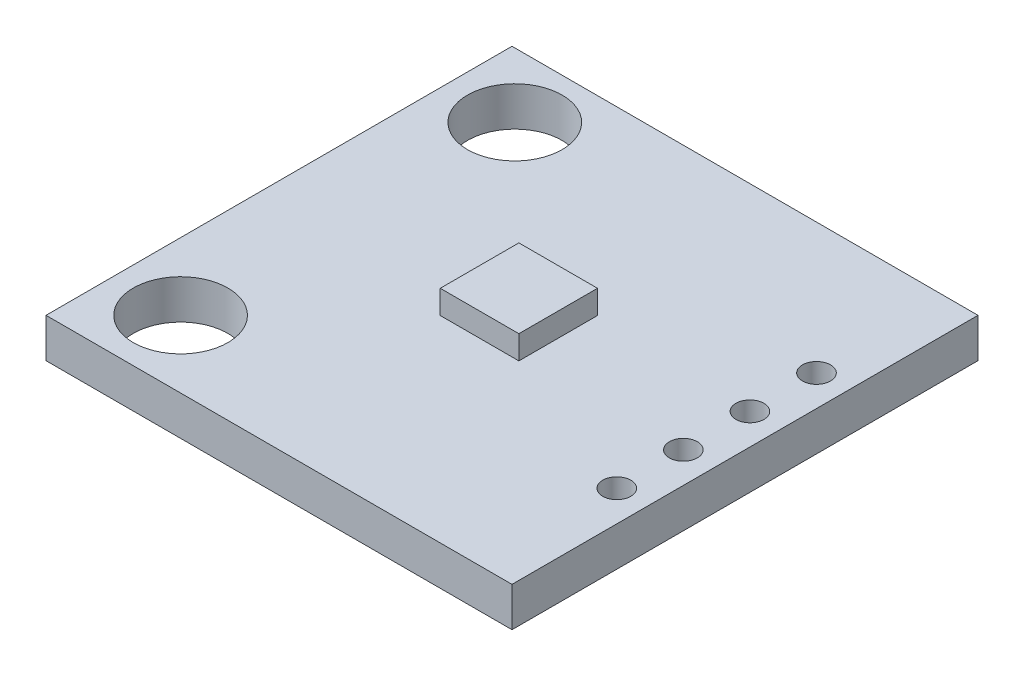
ISO-10303-21;
HEADER;
FILE_DESCRIPTION(('STEP AP214'),'2;1');
FILE_NAME('part.step','',(''),(''),'','','');
FILE_SCHEMA(('AUTOMOTIVE_DESIGN { 1 0 10303 214 1 1 1 1 }'));
ENDSEC;
DATA;
#1=APPLICATION_CONTEXT('core data for automotive mechanical design processes');
#2=APPLICATION_PROTOCOL_DEFINITION('international standard','automotive_design',2000,#1);
#3=PRODUCT_CONTEXT('',#1,'mechanical');
#4=PRODUCT('Part','Part','',(#3));
#5=PRODUCT_RELATED_PRODUCT_CATEGORY('part','',(#4));
#6=PRODUCT_DEFINITION_FORMATION('','',#4);
#7=PRODUCT_DEFINITION_CONTEXT('part definition',#1,'design');
#8=PRODUCT_DEFINITION('design','',#6,#7);
#9=PRODUCT_DEFINITION_SHAPE('','',#8);
#10=(LENGTH_UNIT() NAMED_UNIT(*) SI_UNIT(.MILLI.,.METRE.));
#11=(NAMED_UNIT(*) PLANE_ANGLE_UNIT() SI_UNIT($,.RADIAN.));
#12=(NAMED_UNIT(*) SI_UNIT($,.STERADIAN.) SOLID_ANGLE_UNIT());
#13=UNCERTAINTY_MEASURE_WITH_UNIT(LENGTH_MEASURE(1.E-05),#10,'distance_accuracy_value','');
#14=(GEOMETRIC_REPRESENTATION_CONTEXT(3) GLOBAL_UNCERTAINTY_ASSIGNED_CONTEXT((#13)) GLOBAL_UNIT_ASSIGNED_CONTEXT((#10,
#11,#12)) REPRESENTATION_CONTEXT('',''));
#15=CARTESIAN_POINT('',(0.,0.,0.));
#16=DIRECTION('',(0.,0.,1.));
#17=DIRECTION('',(1.,0.,0.));
#18=AXIS2_PLACEMENT_3D('',#15,#16,#17);
#19=CARTESIAN_POINT('',(0.,1.5,0.));
#20=DIRECTION('',(0.,1.,0.));
#21=DIRECTION('',(0.,0.,1.));
#22=AXIS2_PLACEMENT_3D('',#19,#20,#21);
#23=PLANE('',#22);
#24=DIRECTION('',(0.,0.,1.));
#25=VECTOR('',#24,1.);
#26=CARTESIAN_POINT('',(-29.829781644705,1.5,21.4809932118614));
#27=LINE('',#26,#25);
#28=CARTESIAN_POINT('',(-29.829781644705,1.5,21.4809932118614));
#29=VERTEX_POINT('',#28);
#30=CARTESIAN_POINT('',(-29.829781644705,1.5,39.2609932118614));
#31=VERTEX_POINT('',#30);
#32=EDGE_CURVE('E174',#29,#31,#27,.T.);
#33=ORIENTED_EDGE('',*,*,#32,.T.);
#34=DIRECTION('',(1.,0.,0.));
#35=VECTOR('',#34,1.);
#36=CARTESIAN_POINT('',(-29.829781644705,1.5,39.2609932118614));
#37=LINE('',#36,#35);
#38=CARTESIAN_POINT('',(-12.049781644705,1.5,39.2609932118614));
#39=VERTEX_POINT('',#38);
#40=EDGE_CURVE('E85',#31,#39,#37,.T.);
#41=ORIENTED_EDGE('',*,*,#40,.T.);
#42=DIRECTION('',(0.,0.,1.));
#43=VECTOR('',#42,1.);
#44=CARTESIAN_POINT('',(-12.049781644705,1.5,21.4809932118614));
#45=LINE('',#44,#43);
#46=CARTESIAN_POINT('',(-12.049781644705,1.5,21.4809932118614));
#47=VERTEX_POINT('',#46);
#48=EDGE_CURVE('E178',#47,#39,#45,.T.);
#49=ORIENTED_EDGE('',*,*,#48,.F.);
#50=DIRECTION('',(1.,0.,0.));
#51=VECTOR('',#50,1.);
#52=CARTESIAN_POINT('',(-29.829781644705,1.5,21.4809932118614));
#53=LINE('',#52,#51);
#54=EDGE_CURVE('E181',#29,#47,#53,.T.);
#55=ORIENTED_EDGE('',*,*,#54,.F.);
#56=EDGE_LOOP('',(#33,#41,#49,#55));
#57=FACE_BOUND('',#56,.T.);
#58=CARTESIAN_POINT('',(-27.2622861013751,1.5,23.9415089843509));
#59=DIRECTION('',(0.,1.,0.));
#60=DIRECTION('',(0.,0.,1.));
#61=AXIS2_PLACEMENT_3D('',#58,#59,#60);
#62=CIRCLE('',#61,1.80463173106967);
#63=CARTESIAN_POINT('',(-27.2622861013751,1.5,25.7461407154205));
#64=VERTEX_POINT('',#63);
#65=EDGE_CURVE('E167',#64,#64,#62,.T.);
#66=ORIENTED_EDGE('',*,*,#65,.F.);
#67=EDGE_LOOP('',(#66));
#68=FACE_BOUND('',#67,.T.);
#69=CARTESIAN_POINT('',(-27.2622861013751,1.5,36.6934976685315));
#70=DIRECTION('',(0.,1.,0.));
#71=DIRECTION('',(0.,0.,1.));
#72=AXIS2_PLACEMENT_3D('',#69,#70,#71);
#73=CIRCLE('',#72,1.80463173106967);
#74=CARTESIAN_POINT('',(-27.2622861013751,1.5,38.4981293996011));
#75=VERTEX_POINT('',#74);
#76=EDGE_CURVE('E161',#75,#75,#73,.T.);
#77=ORIENTED_EDGE('',*,*,#76,.F.);
#78=EDGE_LOOP('',(#77));
#79=FACE_BOUND('',#78,.T.);
#80=CARTESIAN_POINT('',(-13.2265401671092,1.5,26.4662315761853));
#81=DIRECTION('',(0.,1.,0.));
#82=DIRECTION('',(0.,0.,1.));
#83=AXIS2_PLACEMENT_3D('',#80,#81,#82);
#84=CIRCLE('',#83,0.534898854202208);
#85=CARTESIAN_POINT('',(-13.2265401671092,1.5,27.0011304303875));
#86=VERTEX_POINT('',#85);
#87=EDGE_CURVE('E155',#86,#86,#84,.T.);
#88=ORIENTED_EDGE('',*,*,#87,.F.);
#89=EDGE_LOOP('',(#88));
#90=FACE_BOUND('',#89,.T.);
#91=CARTESIAN_POINT('',(-13.2265401671092,1.5,29.0062315761853));
#92=DIRECTION('',(0.,1.,0.));
#93=DIRECTION('',(0.,0.,1.));
#94=AXIS2_PLACEMENT_3D('',#91,#92,#93);
#95=CIRCLE('',#94,0.534898854202208);
#96=CARTESIAN_POINT('',(-13.2265401671092,1.5,29.5411304303875));
#97=VERTEX_POINT('',#96);
#98=EDGE_CURVE('E149',#97,#97,#95,.T.);
#99=ORIENTED_EDGE('',*,*,#98,.F.);
#100=EDGE_LOOP('',(#99));
#101=FACE_BOUND('',#100,.T.);
#102=CARTESIAN_POINT('',(-13.2265401671091,1.5,31.5462315761853));
#103=DIRECTION('',(0.,1.,0.));
#104=DIRECTION('',(0.,0.,1.));
#105=AXIS2_PLACEMENT_3D('',#102,#103,#104);
#106=CIRCLE('',#105,0.534898854202208);
#107=CARTESIAN_POINT('',(-13.2265401671091,1.5,32.0811304303875));
#108=VERTEX_POINT('',#107);
#109=EDGE_CURVE('E143',#108,#108,#106,.T.);
#110=ORIENTED_EDGE('',*,*,#109,.F.);
#111=EDGE_LOOP('',(#110));
#112=FACE_BOUND('',#111,.T.);
#113=CARTESIAN_POINT('',(-13.2265401671091,1.5,34.0862315761853));
#114=DIRECTION('',(0.,1.,0.));
#115=DIRECTION('',(0.,0.,1.));
#116=AXIS2_PLACEMENT_3D('',#113,#114,#115);
#117=CIRCLE('',#116,0.534898854202208);
#118=CARTESIAN_POINT('',(-13.2265401671091,1.5,34.6211304303875));
#119=VERTEX_POINT('',#118);
#120=EDGE_CURVE('E133',#119,#119,#117,.T.);
#121=ORIENTED_EDGE('',*,*,#120,.F.);
#122=EDGE_LOOP('',(#121));
#123=FACE_BOUND('',#122,.T.);
#124=DIRECTION('',(1.,0.,0.));
#125=VECTOR('',#124,1.);
#126=CARTESIAN_POINT('',(-22.3014624423402,1.5,31.7470300680396));
#127=LINE('',#126,#125);
#128=CARTESIAN_POINT('',(-22.3014624423402,1.5,31.7470300680396));
#129=VERTEX_POINT('',#128);
#130=CARTESIAN_POINT('',(-19.3014624423402,1.5,31.7470300680396));
#131=VERTEX_POINT('',#130);
#132=EDGE_CURVE('E371',#129,#131,#127,.T.);
#133=ORIENTED_EDGE('',*,*,#132,.F.);
#134=DIRECTION('',(0.,0.,1.));
#135=VECTOR('',#134,1.);
#136=CARTESIAN_POINT('',(-22.3014624423402,1.5,28.7470300680396));
#137=LINE('',#136,#135);
#138=CARTESIAN_POINT('',(-22.3014624423402,1.5,28.7470300680396));
#139=VERTEX_POINT('',#138);
#140=EDGE_CURVE('E131',#139,#129,#137,.T.);
#141=ORIENTED_EDGE('',*,*,#140,.F.);
#142=DIRECTION('',(-1.,0.,0.));
#143=VECTOR('',#142,1.);
#144=CARTESIAN_POINT('',(-22.3014624423402,1.5,28.7470300680396));
#145=LINE('',#144,#143);
#146=CARTESIAN_POINT('',(-19.3014624423402,1.5,28.7470300680396));
#147=VERTEX_POINT('',#146);
#148=EDGE_CURVE('E127',#147,#139,#145,.T.);
#149=ORIENTED_EDGE('',*,*,#148,.F.);
#150=DIRECTION('',(0.,0.,-1.));
#151=VECTOR('',#150,1.);
#152=CARTESIAN_POINT('',(-19.3014624423402,1.5,28.7470300680396));
#153=LINE('',#152,#151);
#154=EDGE_CURVE('E368',#131,#147,#153,.T.);
#155=ORIENTED_EDGE('',*,*,#154,.F.);
#156=EDGE_LOOP('',(#133,#141,#149,#155));
#157=FACE_BOUND('',#156,.T.);
#158=ADVANCED_FACE('F35',(#57,#68,#79,#90,#101,#112,#123,#157),#23,.T.);
#159=CARTESIAN_POINT('',(-29.829781644705,1.5,21.4809932118614));
#160=DIRECTION('',(1.,0.,0.));
#161=DIRECTION('',(0.,0.,-1.));
#162=AXIS2_PLACEMENT_3D('',#159,#160,#161);
#163=PLANE('',#162);
#164=DIRECTION('',(0.,0.,1.));
#165=VECTOR('',#164,1.);
#166=CARTESIAN_POINT('',(-29.829781644705,0.,21.4809932118614));
#167=LINE('',#166,#165);
#168=CARTESIAN_POINT('',(-29.829781644705,0.,21.4809932118614));
#169=VERTEX_POINT('',#168);
#170=CARTESIAN_POINT('',(-29.829781644705,0.,39.2609932118614));
#171=VERTEX_POINT('',#170);
#172=EDGE_CURVE('E173',#169,#171,#167,.T.);
#173=ORIENTED_EDGE('',*,*,#172,.T.);
#174=DIRECTION('',(0.,-1.,0.));
#175=VECTOR('',#174,1.);
#176=CARTESIAN_POINT('',(-29.829781644705,1.5,39.2609932118614));
#177=LINE('',#176,#175);
#178=EDGE_CURVE('E11',#31,#171,#177,.T.);
#179=ORIENTED_EDGE('',*,*,#178,.F.);
#180=ORIENTED_EDGE('',*,*,#32,.F.);
#181=DIRECTION('',(0.,-1.,0.));
#182=VECTOR('',#181,1.);
#183=CARTESIAN_POINT('',(-29.829781644705,1.5,21.4809932118614));
#184=LINE('',#183,#182);
#185=EDGE_CURVE('E59',#29,#169,#184,.T.);
#186=ORIENTED_EDGE('',*,*,#185,.T.);
#187=EDGE_LOOP('',(#173,#179,#180,#186));
#188=FACE_BOUND('',#187,.T.);
#189=ADVANCED_FACE('F37',(#188),#163,.F.);
#190=CARTESIAN_POINT('',(-29.829781644705,1.5,39.2609932118614));
#191=DIRECTION('',(0.,0.,-1.));
#192=DIRECTION('',(-1.,0.,0.));
#193=AXIS2_PLACEMENT_3D('',#190,#191,#192);
#194=PLANE('',#193);
#195=DIRECTION('',(1.,0.,0.));
#196=VECTOR('',#195,1.);
#197=CARTESIAN_POINT('',(-29.829781644705,0.,39.2609932118614));
#198=LINE('',#197,#196);
#199=CARTESIAN_POINT('',(-12.049781644705,0.,39.2609932118614));
#200=VERTEX_POINT('',#199);
#201=EDGE_CURVE('E184',#171,#200,#198,.T.);
#202=ORIENTED_EDGE('',*,*,#201,.T.);
#203=DIRECTION('',(0.,-1.,0.));
#204=VECTOR('',#203,1.);
#205=CARTESIAN_POINT('',(-12.049781644705,1.5,39.2609932118614));
#206=LINE('',#205,#204);
#207=EDGE_CURVE('E43',#39,#200,#206,.T.);
#208=ORIENTED_EDGE('',*,*,#207,.F.);
#209=ORIENTED_EDGE('',*,*,#40,.F.);
#210=ORIENTED_EDGE('',*,*,#178,.T.);
#211=EDGE_LOOP('',(#202,#208,#209,#210));
#212=FACE_BOUND('',#211,.T.);
#213=ADVANCED_FACE('F198',(#212),#194,.F.);
#214=CARTESIAN_POINT('',(-12.049781644705,1.5,21.4809932118614));
#215=DIRECTION('',(1.,0.,0.));
#216=DIRECTION('',(0.,0.,-1.));
#217=AXIS2_PLACEMENT_3D('',#214,#215,#216);
#218=PLANE('',#217);
#219=DIRECTION('',(0.,0.,1.));
#220=VECTOR('',#219,1.);
#221=CARTESIAN_POINT('',(-12.049781644705,0.,21.4809932118614));
#222=LINE('',#221,#220);
#223=CARTESIAN_POINT('',(-12.049781644705,0.,21.4809932118614));
#224=VERTEX_POINT('',#223);
#225=EDGE_CURVE('E187',#224,#200,#222,.T.);
#226=ORIENTED_EDGE('',*,*,#225,.F.);
#227=DIRECTION('',(0.,-1.,0.));
#228=VECTOR('',#227,1.);
#229=CARTESIAN_POINT('',(-12.049781644705,1.5,21.4809932118614));
#230=LINE('',#229,#228);
#231=EDGE_CURVE('E193',#47,#224,#230,.T.);
#232=ORIENTED_EDGE('',*,*,#231,.F.);
#233=ORIENTED_EDGE('',*,*,#48,.T.);
#234=ORIENTED_EDGE('',*,*,#207,.T.);
#235=EDGE_LOOP('',(#226,#232,#233,#234));
#236=FACE_BOUND('',#235,.T.);
#237=ADVANCED_FACE('F196',(#236),#218,.T.);
#238=CARTESIAN_POINT('',(-29.829781644705,1.5,21.4809932118614));
#239=DIRECTION('',(0.,0.,-1.));
#240=DIRECTION('',(-1.,0.,0.));
#241=AXIS2_PLACEMENT_3D('',#238,#239,#240);
#242=PLANE('',#241);
#243=DIRECTION('',(1.,0.,0.));
#244=VECTOR('',#243,1.);
#245=CARTESIAN_POINT('',(-29.829781644705,0.,21.4809932118614));
#246=LINE('',#245,#244);
#247=EDGE_CURVE('E176',#169,#224,#246,.T.);
#248=ORIENTED_EDGE('',*,*,#247,.F.);
#249=ORIENTED_EDGE('',*,*,#185,.F.);
#250=ORIENTED_EDGE('',*,*,#54,.T.);
#251=ORIENTED_EDGE('',*,*,#231,.T.);
#252=EDGE_LOOP('',(#248,#249,#250,#251));
#253=FACE_BOUND('',#252,.T.);
#254=ADVANCED_FACE('F202',(#253),#242,.T.);
#255=CARTESIAN_POINT('',(0.,0.,0.));
#256=DIRECTION('',(0.,1.,0.));
#257=DIRECTION('',(0.,0.,1.));
#258=AXIS2_PLACEMENT_3D('',#255,#256,#257);
#259=PLANE('',#258);
#260=CARTESIAN_POINT('',(-13.2265401671091,0.,34.0862315761853));
#261=DIRECTION('',(0.,1.,0.));
#262=DIRECTION('',(0.,0.,1.));
#263=AXIS2_PLACEMENT_3D('',#260,#261,#262);
#264=CIRCLE('',#263,0.534898854202208);
#265=CARTESIAN_POINT('',(-13.2265401671091,0.,34.6211304303875));
#266=VERTEX_POINT('',#265);
#267=EDGE_CURVE('E136',#266,#266,#264,.F.);
#268=ORIENTED_EDGE('',*,*,#267,.F.);
#269=EDGE_LOOP('',(#268));
#270=FACE_BOUND('',#269,.T.);
#271=CARTESIAN_POINT('',(-13.2265401671091,0.,31.5462315761853));
#272=DIRECTION('',(0.,1.,0.));
#273=DIRECTION('',(0.,0.,1.));
#274=AXIS2_PLACEMENT_3D('',#271,#272,#273);
#275=CIRCLE('',#274,0.534898854202208);
#276=CARTESIAN_POINT('',(-13.2265401671091,0.,32.0811304303875));
#277=VERTEX_POINT('',#276);
#278=EDGE_CURVE('E146',#277,#277,#275,.F.);
#279=ORIENTED_EDGE('',*,*,#278,.F.);
#280=EDGE_LOOP('',(#279));
#281=FACE_BOUND('',#280,.T.);
#282=CARTESIAN_POINT('',(-13.2265401671092,0.,29.0062315761853));
#283=DIRECTION('',(0.,1.,0.));
#284=DIRECTION('',(0.,0.,1.));
#285=AXIS2_PLACEMENT_3D('',#282,#283,#284);
#286=CIRCLE('',#285,0.534898854202208);
#287=CARTESIAN_POINT('',(-13.2265401671092,0.,29.5411304303875));
#288=VERTEX_POINT('',#287);
#289=EDGE_CURVE('E152',#288,#288,#286,.F.);
#290=ORIENTED_EDGE('',*,*,#289,.F.);
#291=EDGE_LOOP('',(#290));
#292=FACE_BOUND('',#291,.T.);
#293=CARTESIAN_POINT('',(-13.2265401671092,0.,26.4662315761853));
#294=DIRECTION('',(0.,1.,0.));
#295=DIRECTION('',(0.,0.,1.));
#296=AXIS2_PLACEMENT_3D('',#293,#294,#295);
#297=CIRCLE('',#296,0.534898854202208);
#298=CARTESIAN_POINT('',(-13.2265401671092,0.,27.0011304303875));
#299=VERTEX_POINT('',#298);
#300=EDGE_CURVE('E158',#299,#299,#297,.F.);
#301=ORIENTED_EDGE('',*,*,#300,.F.);
#302=EDGE_LOOP('',(#301));
#303=FACE_BOUND('',#302,.T.);
#304=CARTESIAN_POINT('',(-27.2622861013751,0.,36.6934976685315));
#305=DIRECTION('',(0.,1.,0.));
#306=DIRECTION('',(0.,0.,1.));
#307=AXIS2_PLACEMENT_3D('',#304,#305,#306);
#308=CIRCLE('',#307,1.80463173106967);
#309=CARTESIAN_POINT('',(-27.2622861013751,0.,38.4981293996011));
#310=VERTEX_POINT('',#309);
#311=EDGE_CURVE('E164',#310,#310,#308,.F.);
#312=ORIENTED_EDGE('',*,*,#311,.F.);
#313=EDGE_LOOP('',(#312));
#314=FACE_BOUND('',#313,.T.);
#315=CARTESIAN_POINT('',(-27.2622861013751,0.,23.9415089843509));
#316=DIRECTION('',(0.,1.,0.));
#317=DIRECTION('',(0.,0.,1.));
#318=AXIS2_PLACEMENT_3D('',#315,#316,#317);
#319=CIRCLE('',#318,1.80463173106967);
#320=CARTESIAN_POINT('',(-27.2622861013751,0.,25.7461407154205));
#321=VERTEX_POINT('',#320);
#322=EDGE_CURVE('E170',#321,#321,#319,.F.);
#323=ORIENTED_EDGE('',*,*,#322,.F.);
#324=EDGE_LOOP('',(#323));
#325=FACE_BOUND('',#324,.T.);
#326=ORIENTED_EDGE('',*,*,#172,.F.);
#327=ORIENTED_EDGE('',*,*,#247,.T.);
#328=ORIENTED_EDGE('',*,*,#225,.T.);
#329=ORIENTED_EDGE('',*,*,#201,.F.);
#330=EDGE_LOOP('',(#326,#327,#328,#329));
#331=FACE_BOUND('',#330,.T.);
#332=ADVANCED_FACE('F201',(#270,#281,#292,#303,#314,#325,#331),#259,.F.);
#333=CARTESIAN_POINT('',(-27.2622861013751,-0.000999999999999916,23.9415089843509));
#334=DIRECTION('',(0.,1.,0.));
#335=DIRECTION('',(0.,0.,1.));
#336=AXIS2_PLACEMENT_3D('',#333,#334,#335);
#337=CYLINDRICAL_SURFACE('',#336,1.80463173106967);
#338=ORIENTED_EDGE('',*,*,#65,.T.);
#339=EDGE_LOOP('',(#338));
#340=FACE_BOUND('',#339,.T.);
#341=ORIENTED_EDGE('',*,*,#322,.T.);
#342=EDGE_LOOP('',(#341));
#343=FACE_BOUND('',#342,.T.);
#344=ADVANCED_FACE('F216',(#340,#343),#337,.F.);
#345=CARTESIAN_POINT('',(-27.2622861013751,-0.000999999999999916,36.6934976685315));
#346=DIRECTION('',(0.,1.,0.));
#347=DIRECTION('',(0.,0.,1.));
#348=AXIS2_PLACEMENT_3D('',#345,#346,#347);
#349=CYLINDRICAL_SURFACE('',#348,1.80463173106967);
#350=ORIENTED_EDGE('',*,*,#76,.T.);
#351=EDGE_LOOP('',(#350));
#352=FACE_BOUND('',#351,.T.);
#353=ORIENTED_EDGE('',*,*,#311,.T.);
#354=EDGE_LOOP('',(#353));
#355=FACE_BOUND('',#354,.T.);
#356=ADVANCED_FACE('F242',(#352,#355),#349,.F.);
#357=CARTESIAN_POINT('',(-13.2265401671092,-0.000999999999999916,26.4662315761853));
#358=DIRECTION('',(0.,1.,0.));
#359=DIRECTION('',(0.,0.,1.));
#360=AXIS2_PLACEMENT_3D('',#357,#358,#359);
#361=CYLINDRICAL_SURFACE('',#360,0.534898854202208);
#362=ORIENTED_EDGE('',*,*,#87,.T.);
#363=EDGE_LOOP('',(#362));
#364=FACE_BOUND('',#363,.T.);
#365=ORIENTED_EDGE('',*,*,#300,.T.);
#366=EDGE_LOOP('',(#365));
#367=FACE_BOUND('',#366,.T.);
#368=ADVANCED_FACE('F249',(#364,#367),#361,.F.);
#369=CARTESIAN_POINT('',(-13.2265401671092,-0.000999999999999916,29.0062315761853));
#370=DIRECTION('',(0.,1.,0.));
#371=DIRECTION('',(0.,0.,1.));
#372=AXIS2_PLACEMENT_3D('',#369,#370,#371);
#373=CYLINDRICAL_SURFACE('',#372,0.534898854202208);
#374=ORIENTED_EDGE('',*,*,#98,.T.);
#375=EDGE_LOOP('',(#374));
#376=FACE_BOUND('',#375,.T.);
#377=ORIENTED_EDGE('',*,*,#289,.T.);
#378=EDGE_LOOP('',(#377));
#379=FACE_BOUND('',#378,.T.);
#380=ADVANCED_FACE('F256',(#376,#379),#373,.F.);
#381=CARTESIAN_POINT('',(-13.2265401671091,-0.000999999999999916,31.5462315761853));
#382=DIRECTION('',(0.,1.,0.));
#383=DIRECTION('',(0.,0.,1.));
#384=AXIS2_PLACEMENT_3D('',#381,#382,#383);
#385=CYLINDRICAL_SURFACE('',#384,0.534898854202208);
#386=ORIENTED_EDGE('',*,*,#109,.T.);
#387=EDGE_LOOP('',(#386));
#388=FACE_BOUND('',#387,.T.);
#389=ORIENTED_EDGE('',*,*,#278,.T.);
#390=EDGE_LOOP('',(#389));
#391=FACE_BOUND('',#390,.T.);
#392=ADVANCED_FACE('F264',(#388,#391),#385,.F.);
#393=CARTESIAN_POINT('',(-13.2265401671091,-0.000999999999999916,34.0862315761853));
#394=DIRECTION('',(0.,1.,0.));
#395=DIRECTION('',(0.,0.,1.));
#396=AXIS2_PLACEMENT_3D('',#393,#394,#395);
#397=CYLINDRICAL_SURFACE('',#396,0.534898854202208);
#398=ORIENTED_EDGE('',*,*,#120,.T.);
#399=EDGE_LOOP('',(#398));
#400=FACE_BOUND('',#399,.T.);
#401=ORIENTED_EDGE('',*,*,#267,.T.);
#402=EDGE_LOOP('',(#401));
#403=FACE_BOUND('',#402,.T.);
#404=ADVANCED_FACE('F272',(#400,#403),#397,.F.);
#405=CARTESIAN_POINT('',(-22.3014624423402,2.4,28.7470300680396));
#406=DIRECTION('',(1.,0.,0.));
#407=DIRECTION('',(0.,0.,-1.));
#408=AXIS2_PLACEMENT_3D('',#405,#406,#407);
#409=PLANE('',#408);
#410=ORIENTED_EDGE('',*,*,#140,.T.);
#411=DIRECTION('',(0.,-1.,0.));
#412=VECTOR('',#411,1.);
#413=CARTESIAN_POINT('',(-22.3014624423402,2.4,31.7470300680396));
#414=LINE('',#413,#412);
#415=CARTESIAN_POINT('',(-22.3014624423402,2.4,31.7470300680396));
#416=VERTEX_POINT('',#415);
#417=EDGE_CURVE('E112',#416,#129,#414,.T.);
#418=ORIENTED_EDGE('',*,*,#417,.F.);
#419=DIRECTION('',(0.,0.,1.));
#420=VECTOR('',#419,1.);
#421=CARTESIAN_POINT('',(-22.3014624423402,2.4,28.7470300680396));
#422=LINE('',#421,#420);
#423=CARTESIAN_POINT('',(-22.3014624423402,2.4,28.7470300680396));
#424=VERTEX_POINT('',#423);
#425=EDGE_CURVE('E119',#424,#416,#422,.T.);
#426=ORIENTED_EDGE('',*,*,#425,.F.);
#427=DIRECTION('',(0.,-1.,0.));
#428=VECTOR('',#427,1.);
#429=CARTESIAN_POINT('',(-22.3014624423402,2.4,28.7470300680396));
#430=LINE('',#429,#428);
#431=EDGE_CURVE('E365',#424,#139,#430,.T.);
#432=ORIENTED_EDGE('',*,*,#431,.T.);
#433=EDGE_LOOP('',(#410,#418,#426,#432));
#434=FACE_BOUND('',#433,.T.);
#435=ADVANCED_FACE('F129',(#434),#409,.F.);
#436=CARTESIAN_POINT('',(-22.3014624423402,2.4,31.7470300680396));
#437=DIRECTION('',(0.,0.,-1.));
#438=DIRECTION('',(-1.,0.,0.));
#439=AXIS2_PLACEMENT_3D('',#436,#437,#438);
#440=PLANE('',#439);
#441=ORIENTED_EDGE('',*,*,#132,.T.);
#442=DIRECTION('',(0.,-1.,0.));
#443=VECTOR('',#442,1.);
#444=CARTESIAN_POINT('',(-19.3014624423402,2.4,31.7470300680396));
#445=LINE('',#444,#443);
#446=CARTESIAN_POINT('',(-19.3014624423402,2.4,31.7470300680396));
#447=VERTEX_POINT('',#446);
#448=EDGE_CURVE('E115',#447,#131,#445,.T.);
#449=ORIENTED_EDGE('',*,*,#448,.F.);
#450=DIRECTION('',(1.,0.,0.));
#451=VECTOR('',#450,1.);
#452=CARTESIAN_POINT('',(-22.3014624423402,2.4,31.7470300680396));
#453=LINE('',#452,#451);
#454=EDGE_CURVE('E108',#416,#447,#453,.T.);
#455=ORIENTED_EDGE('',*,*,#454,.F.);
#456=ORIENTED_EDGE('',*,*,#417,.T.);
#457=EDGE_LOOP('',(#441,#449,#455,#456));
#458=FACE_BOUND('',#457,.T.);
#459=ADVANCED_FACE('F110',(#458),#440,.F.);
#460=CARTESIAN_POINT('',(-19.3014624423402,2.4,28.7470300680396));
#461=DIRECTION('',(-1.,0.,0.));
#462=DIRECTION('',(0.,0.,1.));
#463=AXIS2_PLACEMENT_3D('',#460,#461,#462);
#464=PLANE('',#463);
#465=ORIENTED_EDGE('',*,*,#154,.T.);
#466=DIRECTION('',(0.,-1.,0.));
#467=VECTOR('',#466,1.);
#468=CARTESIAN_POINT('',(-19.3014624423402,2.4,28.7470300680396));
#469=LINE('',#468,#467);
#470=CARTESIAN_POINT('',(-19.3014624423402,2.4,28.7470300680396));
#471=VERTEX_POINT('',#470);
#472=EDGE_CURVE('E50',#471,#147,#469,.T.);
#473=ORIENTED_EDGE('',*,*,#472,.F.);
#474=DIRECTION('',(0.,0.,-1.));
#475=VECTOR('',#474,1.);
#476=CARTESIAN_POINT('',(-19.3014624423402,2.4,28.7470300680396));
#477=LINE('',#476,#475);
#478=EDGE_CURVE('E118',#447,#471,#477,.T.);
#479=ORIENTED_EDGE('',*,*,#478,.F.);
#480=ORIENTED_EDGE('',*,*,#448,.T.);
#481=EDGE_LOOP('',(#465,#473,#479,#480));
#482=FACE_BOUND('',#481,.T.);
#483=ADVANCED_FACE('F294',(#482),#464,.F.);
#484=CARTESIAN_POINT('',(-22.3014624423402,2.4,28.7470300680396));
#485=DIRECTION('',(0.,0.,1.));
#486=DIRECTION('',(1.,0.,0.));
#487=AXIS2_PLACEMENT_3D('',#484,#485,#486);
#488=PLANE('',#487);
#489=ORIENTED_EDGE('',*,*,#148,.T.);
#490=ORIENTED_EDGE('',*,*,#431,.F.);
#491=DIRECTION('',(-1.,0.,0.));
#492=VECTOR('',#491,1.);
#493=CARTESIAN_POINT('',(-22.3014624423402,2.4,28.7470300680396));
#494=LINE('',#493,#492);
#495=EDGE_CURVE('E123',#471,#424,#494,.T.);
#496=ORIENTED_EDGE('',*,*,#495,.F.);
#497=ORIENTED_EDGE('',*,*,#472,.T.);
#498=EDGE_LOOP('',(#489,#490,#496,#497));
#499=FACE_BOUND('',#498,.T.);
#500=ADVANCED_FACE('F300',(#499),#488,.F.);
#501=CARTESIAN_POINT('',(0.,2.4,0.));
#502=DIRECTION('',(0.,1.,0.));
#503=DIRECTION('',(0.,0.,1.));
#504=AXIS2_PLACEMENT_3D('',#501,#502,#503);
#505=PLANE('',#504);
#506=ORIENTED_EDGE('',*,*,#425,.T.);
#507=ORIENTED_EDGE('',*,*,#454,.T.);
#508=ORIENTED_EDGE('',*,*,#478,.T.);
#509=ORIENTED_EDGE('',*,*,#495,.T.);
#510=EDGE_LOOP('',(#506,#507,#508,#509));
#511=FACE_BOUND('',#510,.T.);
#512=ADVANCED_FACE('F122',(#511),#505,.T.);
#513=CLOSED_SHELL('',(#158,#189,#213,#237,#254,#332,#344,#356,#368,#380,#392,#404,#435,#459,
#483,#500,#512));
#514=MANIFOLD_SOLID_BREP('B2',#513);
#515=ADVANCED_BREP_SHAPE_REPRESENTATION('',(#18,#514),#14);
#516=SHAPE_DEFINITION_REPRESENTATION(#9,#515);
ENDSEC;
END-ISO-10303-21;
